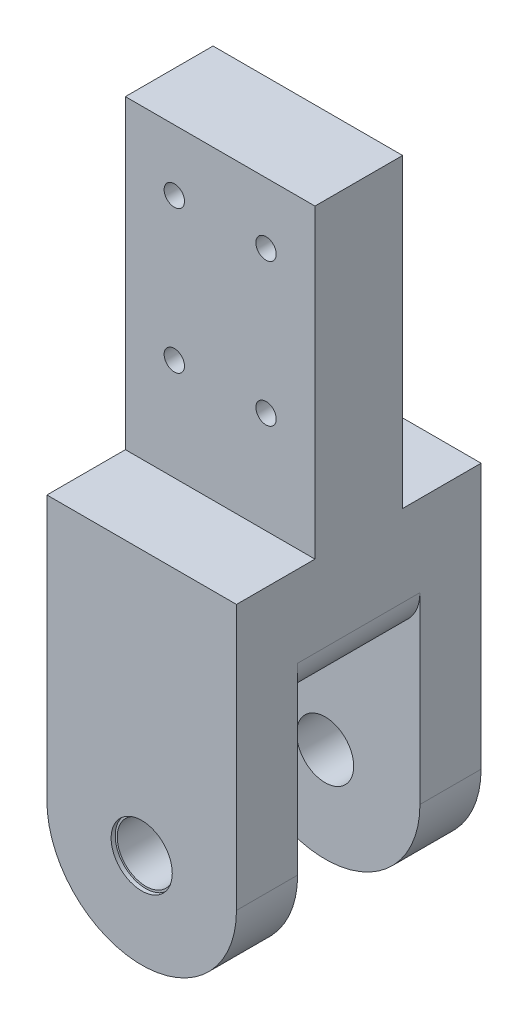
ISO-10303-21;
HEADER;
FILE_DESCRIPTION(('STEP AP214'),'2;1');
FILE_NAME('part.step','',(''),(''),'','','');
FILE_SCHEMA(('AUTOMOTIVE_DESIGN { 1 0 10303 214 1 1 1 1 }'));
ENDSEC;
DATA;
#1=APPLICATION_CONTEXT('core data for automotive mechanical design processes');
#2=APPLICATION_PROTOCOL_DEFINITION('international standard','automotive_design',2000,#1);
#3=PRODUCT_CONTEXT('',#1,'mechanical');
#4=PRODUCT('Part','Part','',(#3));
#5=PRODUCT_RELATED_PRODUCT_CATEGORY('part','',(#4));
#6=PRODUCT_DEFINITION_FORMATION('','',#4);
#7=PRODUCT_DEFINITION_CONTEXT('part definition',#1,'design');
#8=PRODUCT_DEFINITION('design','',#6,#7);
#9=PRODUCT_DEFINITION_SHAPE('','',#8);
#10=(LENGTH_UNIT() NAMED_UNIT(*) SI_UNIT(.MILLI.,.METRE.));
#11=(NAMED_UNIT(*) PLANE_ANGLE_UNIT() SI_UNIT($,.RADIAN.));
#12=(NAMED_UNIT(*) SI_UNIT($,.STERADIAN.) SOLID_ANGLE_UNIT());
#13=UNCERTAINTY_MEASURE_WITH_UNIT(LENGTH_MEASURE(1.E-05),#10,'distance_accuracy_value','');
#14=(GEOMETRIC_REPRESENTATION_CONTEXT(3) GLOBAL_UNCERTAINTY_ASSIGNED_CONTEXT((#13)) GLOBAL_UNIT_ASSIGNED_CONTEXT((#10,
#11,#12)) REPRESENTATION_CONTEXT('',''));
#15=CARTESIAN_POINT('',(0.,0.,0.));
#16=DIRECTION('',(0.,0.,1.));
#17=DIRECTION('',(1.,0.,0.));
#18=AXIS2_PLACEMENT_3D('',#15,#16,#17);
#19=CARTESIAN_POINT('',(23.25,140.,30.));
#20=DIRECTION('',(-1.,0.,0.));
#21=DIRECTION('',(0.,0.,1.));
#22=AXIS2_PLACEMENT_3D('',#19,#20,#21);
#23=PLANE('',#22);
#24=DIRECTION('',(0.,-1.,0.));
#25=VECTOR('',#24,1.);
#26=CARTESIAN_POINT('',(23.25,35.,15.));
#27=LINE('',#26,#25);
#28=CARTESIAN_POINT('',(23.25,45.,15.));
#29=VERTEX_POINT('',#28);
#30=CARTESIAN_POINT('',(23.25,0.,15.));
#31=VERTEX_POINT('',#30);
#32=EDGE_CURVE('E193',#29,#31,#27,.T.);
#33=ORIENTED_EDGE('',*,*,#32,.F.);
#34=DIRECTION('',(0.,0.,1.));
#35=VECTOR('',#34,1.);
#36=CARTESIAN_POINT('',(23.25,45.,30.));
#37=LINE('',#36,#35);
#38=CARTESIAN_POINT('',(23.25,45.,-15.));
#39=VERTEX_POINT('',#38);
#40=EDGE_CURVE('E215',#29,#39,#37,.F.);
#41=ORIENTED_EDGE('',*,*,#40,.T.);
#42=DIRECTION('',(0.,1.,0.));
#43=VECTOR('',#42,1.);
#44=CARTESIAN_POINT('',(23.25,35.,-15.));
#45=LINE('',#44,#43);
#46=CARTESIAN_POINT('',(23.25,0.,-15.));
#47=VERTEX_POINT('',#46);
#48=EDGE_CURVE('E274',#47,#39,#45,.T.);
#49=ORIENTED_EDGE('',*,*,#48,.F.);
#50=DIRECTION('',(0.,0.,-1.));
#51=VECTOR('',#50,1.);
#52=CARTESIAN_POINT('',(23.25,0.,30.));
#53=LINE('',#52,#51);
#54=CARTESIAN_POINT('',(23.25,0.,-30.));
#55=VERTEX_POINT('',#54);
#56=EDGE_CURVE('E171',#47,#55,#53,.T.);
#57=ORIENTED_EDGE('',*,*,#56,.T.);
#58=DIRECTION('',(0.,1.,0.));
#59=VECTOR('',#58,1.);
#60=CARTESIAN_POINT('',(23.25,140.,-30.));
#61=LINE('',#60,#59);
#62=CARTESIAN_POINT('',(23.25,65.,-30.));
#63=VERTEX_POINT('',#62);
#64=EDGE_CURVE('E256',#55,#63,#61,.T.);
#65=ORIENTED_EDGE('',*,*,#64,.T.);
#66=DIRECTION('',(0.,0.,-1.));
#67=VECTOR('',#66,1.);
#68=CARTESIAN_POINT('',(23.25,65.,-30.));
#69=LINE('',#68,#67);
#70=CARTESIAN_POINT('',(23.25,65.,-10.75));
#71=VERTEX_POINT('',#70);
#72=EDGE_CURVE('E275',#71,#63,#69,.T.);
#73=ORIENTED_EDGE('',*,*,#72,.F.);
#74=DIRECTION('',(0.,-1.,0.));
#75=VECTOR('',#74,1.);
#76=CARTESIAN_POINT('',(23.25,140.,-10.75));
#77=LINE('',#76,#75);
#78=CARTESIAN_POINT('',(23.25,140.,-10.75));
#79=VERTEX_POINT('',#78);
#80=EDGE_CURVE('E154',#79,#71,#77,.T.);
#81=ORIENTED_EDGE('',*,*,#80,.F.);
#82=DIRECTION('',(0.,0.,-1.));
#83=VECTOR('',#82,1.);
#84=CARTESIAN_POINT('',(23.25,140.,30.));
#85=LINE('',#84,#83);
#86=CARTESIAN_POINT('',(23.25,140.,10.75));
#87=VERTEX_POINT('',#86);
#88=EDGE_CURVE('E161',#87,#79,#85,.T.);
#89=ORIENTED_EDGE('',*,*,#88,.F.);
#90=DIRECTION('',(0.,-1.,0.));
#91=VECTOR('',#90,1.);
#92=CARTESIAN_POINT('',(23.25,140.,10.75));
#93=LINE('',#92,#91);
#94=CARTESIAN_POINT('',(23.25,65.,10.75));
#95=VERTEX_POINT('',#94);
#96=EDGE_CURVE('E316',#87,#95,#93,.T.);
#97=ORIENTED_EDGE('',*,*,#96,.T.);
#98=DIRECTION('',(0.,0.,-1.));
#99=VECTOR('',#98,1.);
#100=CARTESIAN_POINT('',(23.25,65.,30.));
#101=LINE('',#100,#99);
#102=CARTESIAN_POINT('',(23.25,65.,30.));
#103=VERTEX_POINT('',#102);
#104=EDGE_CURVE('E292',#103,#95,#101,.T.);
#105=ORIENTED_EDGE('',*,*,#104,.F.);
#106=DIRECTION('',(0.,1.,0.));
#107=VECTOR('',#106,1.);
#108=CARTESIAN_POINT('',(23.25,140.,30.));
#109=LINE('',#108,#107);
#110=CARTESIAN_POINT('',(23.25,0.,30.));
#111=VERTEX_POINT('',#110);
#112=EDGE_CURVE('E248',#111,#103,#109,.T.);
#113=ORIENTED_EDGE('',*,*,#112,.F.);
#114=EDGE_CURVE('E178',#111,#31,#53,.T.);
#115=ORIENTED_EDGE('',*,*,#114,.T.);
#116=EDGE_LOOP('',(#33,#41,#49,#57,#65,#73,#81,#89,#97,#105,#113,#115));
#117=FACE_BOUND('',#116,.T.);
#118=ADVANCED_FACE('F41',(#117),#23,.F.);
#119=CARTESIAN_POINT('',(-23.25,140.,30.));
#120=DIRECTION('',(0.,-1.,0.));
#121=DIRECTION('',(0.,0.,-1.));
#122=AXIS2_PLACEMENT_3D('',#119,#120,#121);
#123=PLANE('',#122);
#124=DIRECTION('',(1.,0.,0.));
#125=VECTOR('',#124,1.);
#126=CARTESIAN_POINT('',(-23.25,140.,-10.75));
#127=LINE('',#126,#125);
#128=CARTESIAN_POINT('',(-23.25,140.,-10.75));
#129=VERTEX_POINT('',#128);
#130=EDGE_CURVE('E146',#129,#79,#127,.T.);
#131=ORIENTED_EDGE('',*,*,#130,.F.);
#132=DIRECTION('',(0.,0.,-1.));
#133=VECTOR('',#132,1.);
#134=CARTESIAN_POINT('',(-23.25,140.,30.));
#135=LINE('',#134,#133);
#136=CARTESIAN_POINT('',(-23.25,140.,10.75));
#137=VERTEX_POINT('',#136);
#138=EDGE_CURVE('E163',#137,#129,#135,.T.);
#139=ORIENTED_EDGE('',*,*,#138,.F.);
#140=DIRECTION('',(-1.,0.,0.));
#141=VECTOR('',#140,1.);
#142=CARTESIAN_POINT('',(23.25,140.,10.75));
#143=LINE('',#142,#141);
#144=EDGE_CURVE('E312',#87,#137,#143,.T.);
#145=ORIENTED_EDGE('',*,*,#144,.F.);
#146=ORIENTED_EDGE('',*,*,#88,.T.);
#147=EDGE_LOOP('',(#131,#139,#145,#146));
#148=FACE_BOUND('',#147,.T.);
#149=ADVANCED_FACE('F157',(#148),#123,.F.);
#150=CARTESIAN_POINT('',(-23.25,0.,30.));
#151=DIRECTION('',(1.,0.,0.));
#152=DIRECTION('',(0.,0.,-1.));
#153=AXIS2_PLACEMENT_3D('',#150,#151,#152);
#154=PLANE('',#153);
#155=DIRECTION('',(0.,0.,1.));
#156=VECTOR('',#155,1.);
#157=CARTESIAN_POINT('',(-23.25,45.,30.));
#158=LINE('',#157,#156);
#159=CARTESIAN_POINT('',(-23.25,45.,-15.));
#160=VERTEX_POINT('',#159);
#161=CARTESIAN_POINT('',(-23.25,45.,15.));
#162=VERTEX_POINT('',#161);
#163=EDGE_CURVE('E217',#160,#162,#158,.T.);
#164=ORIENTED_EDGE('',*,*,#163,.T.);
#165=DIRECTION('',(0.,-1.,0.));
#166=VECTOR('',#165,1.);
#167=CARTESIAN_POINT('',(-23.25,35.,15.));
#168=LINE('',#167,#166);
#169=CARTESIAN_POINT('',(-23.25,0.,15.));
#170=VERTEX_POINT('',#169);
#171=EDGE_CURVE('E57',#162,#170,#168,.T.);
#172=ORIENTED_EDGE('',*,*,#171,.T.);
#173=DIRECTION('',(0.,0.,-1.));
#174=VECTOR('',#173,1.);
#175=CARTESIAN_POINT('',(-23.25,0.,30.));
#176=LINE('',#175,#174);
#177=CARTESIAN_POINT('',(-23.25,0.,30.));
#178=VERTEX_POINT('',#177);
#179=EDGE_CURVE('E169',#178,#170,#176,.T.);
#180=ORIENTED_EDGE('',*,*,#179,.F.);
#181=DIRECTION('',(0.,-1.,0.));
#182=VECTOR('',#181,1.);
#183=CARTESIAN_POINT('',(-23.25,0.,30.));
#184=LINE('',#183,#182);
#185=CARTESIAN_POINT('',(-23.25,65.,30.));
#186=VERTEX_POINT('',#185);
#187=EDGE_CURVE('E254',#186,#178,#184,.T.);
#188=ORIENTED_EDGE('',*,*,#187,.F.);
#189=DIRECTION('',(0.,0.,-1.));
#190=VECTOR('',#189,1.);
#191=CARTESIAN_POINT('',(-23.25,65.,30.));
#192=LINE('',#191,#190);
#193=CARTESIAN_POINT('',(-23.25,65.,10.75));
#194=VERTEX_POINT('',#193);
#195=EDGE_CURVE('E298',#186,#194,#192,.T.);
#196=ORIENTED_EDGE('',*,*,#195,.T.);
#197=DIRECTION('',(0.,-1.,0.));
#198=VECTOR('',#197,1.);
#199=CARTESIAN_POINT('',(-23.25,140.,10.75));
#200=LINE('',#199,#198);
#201=EDGE_CURVE('E166',#137,#194,#200,.T.);
#202=ORIENTED_EDGE('',*,*,#201,.F.);
#203=ORIENTED_EDGE('',*,*,#138,.T.);
#204=DIRECTION('',(0.,-1.,0.));
#205=VECTOR('',#204,1.);
#206=CARTESIAN_POINT('',(-23.25,140.,-10.75));
#207=LINE('',#206,#205);
#208=CARTESIAN_POINT('',(-23.25,65.,-10.75));
#209=VERTEX_POINT('',#208);
#210=EDGE_CURVE('E141',#129,#209,#207,.T.);
#211=ORIENTED_EDGE('',*,*,#210,.T.);
#212=DIRECTION('',(0.,0.,-1.));
#213=VECTOR('',#212,1.);
#214=CARTESIAN_POINT('',(-23.25,65.,-30.));
#215=LINE('',#214,#213);
#216=CARTESIAN_POINT('',(-23.25,65.,-30.));
#217=VERTEX_POINT('',#216);
#218=EDGE_CURVE('E262',#209,#217,#215,.T.);
#219=ORIENTED_EDGE('',*,*,#218,.T.);
#220=DIRECTION('',(0.,-1.,0.));
#221=VECTOR('',#220,1.);
#222=CARTESIAN_POINT('',(-23.25,0.,-30.));
#223=LINE('',#222,#221);
#224=CARTESIAN_POINT('',(-23.25,0.,-30.));
#225=VERTEX_POINT('',#224);
#226=EDGE_CURVE('E249',#217,#225,#223,.T.);
#227=ORIENTED_EDGE('',*,*,#226,.T.);
#228=CARTESIAN_POINT('',(-23.25,0.,-15.));
#229=VERTEX_POINT('',#228);
#230=EDGE_CURVE('E172',#229,#225,#176,.T.);
#231=ORIENTED_EDGE('',*,*,#230,.F.);
#232=DIRECTION('',(0.,1.,0.));
#233=VECTOR('',#232,1.);
#234=CARTESIAN_POINT('',(-23.25,35.,-15.));
#235=LINE('',#234,#233);
#236=EDGE_CURVE('E63',#229,#160,#235,.T.);
#237=ORIENTED_EDGE('',*,*,#236,.T.);
#238=EDGE_LOOP('',(#164,#172,#180,#188,#196,#202,#203,#211,#219,#227,#231,#237));
#239=FACE_BOUND('',#238,.T.);
#240=ADVANCED_FACE('F168',(#239),#154,.F.);
#241=CARTESIAN_POINT('',(0.,0.,30.));
#242=DIRECTION('',(0.,0.,-1.));
#243=DIRECTION('',(-1.,0.,0.));
#244=AXIS2_PLACEMENT_3D('',#241,#242,#243);
#245=CYLINDRICAL_SURFACE('',#244,7.);
#246=CARTESIAN_POINT('',(0.,0.,-15.));
#247=DIRECTION('',(0.,0.,-1.));
#248=DIRECTION('',(0.,1.,0.));
#249=AXIS2_PLACEMENT_3D('',#246,#247,#248);
#250=CIRCLE('',#249,7.);
#251=CARTESIAN_POINT('',(0.,7.,-15.));
#252=VERTEX_POINT('',#251);
#253=EDGE_CURVE('E185',#252,#252,#250,.T.);
#254=ORIENTED_EDGE('',*,*,#253,.F.);
#255=EDGE_LOOP('',(#254));
#256=FACE_BOUND('',#255,.T.);
#257=CARTESIAN_POINT('',(0.,0.,-29.));
#258=DIRECTION('',(0.,0.,-1.));
#259=DIRECTION('',(-1.,0.,0.));
#260=AXIS2_PLACEMENT_3D('',#257,#258,#259);
#261=CIRCLE('',#260,7.);
#262=CARTESIAN_POINT('',(-7.,0.,-29.));
#263=VERTEX_POINT('',#262);
#264=EDGE_CURVE('E197',#263,#263,#261,.T.);
#265=ORIENTED_EDGE('',*,*,#264,.T.);
#266=EDGE_LOOP('',(#265));
#267=FACE_BOUND('',#266,.T.);
#268=ADVANCED_FACE('F377',(#256,#267),#245,.F.);
#269=CARTESIAN_POINT('',(0.,0.,15.));
#270=DIRECTION('',(0.,0.,1.));
#271=DIRECTION('',(0.,-1.,0.));
#272=AXIS2_PLACEMENT_3D('',#269,#270,#271);
#273=CIRCLE('',#272,7.);
#274=CARTESIAN_POINT('',(0.,-7.,15.));
#275=VERTEX_POINT('',#274);
#276=EDGE_CURVE('E190',#275,#275,#273,.T.);
#277=ORIENTED_EDGE('',*,*,#276,.F.);
#278=EDGE_LOOP('',(#277));
#279=FACE_BOUND('',#278,.T.);
#280=CARTESIAN_POINT('',(0.,0.,29.));
#281=DIRECTION('',(0.,0.,1.));
#282=DIRECTION('',(1.,0.,0.));
#283=AXIS2_PLACEMENT_3D('',#280,#281,#282);
#284=CIRCLE('',#283,7.);
#285=CARTESIAN_POINT('',(7.,0.,29.));
#286=VERTEX_POINT('',#285);
#287=EDGE_CURVE('E194',#286,#286,#284,.T.);
#288=ORIENTED_EDGE('',*,*,#287,.T.);
#289=EDGE_LOOP('',(#288));
#290=FACE_BOUND('',#289,.T.);
#291=ADVANCED_FACE('F373',(#279,#290),#245,.F.);
#292=CARTESIAN_POINT('',(0.,0.,30.));
#293=DIRECTION('',(0.,0.,-1.));
#294=DIRECTION('',(-1.,0.,0.));
#295=AXIS2_PLACEMENT_3D('',#292,#293,#294);
#296=CYLINDRICAL_SURFACE('',#295,23.25);
#297=CARTESIAN_POINT('',(0.,0.,15.));
#298=DIRECTION('',(0.,0.,1.));
#299=DIRECTION('',(0.,-1.,0.));
#300=AXIS2_PLACEMENT_3D('',#297,#298,#299);
#301=CIRCLE('',#300,23.25);
#302=EDGE_CURVE('E188',#170,#31,#301,.T.);
#303=ORIENTED_EDGE('',*,*,#302,.T.);
#304=ORIENTED_EDGE('',*,*,#114,.F.);
#305=CARTESIAN_POINT('',(0.,0.,30.));
#306=DIRECTION('',(0.,0.,1.));
#307=DIRECTION('',(1.,0.,0.));
#308=AXIS2_PLACEMENT_3D('',#305,#306,#307);
#309=CIRCLE('',#308,23.25);
#310=EDGE_CURVE('E246',#178,#111,#309,.T.);
#311=ORIENTED_EDGE('',*,*,#310,.F.);
#312=ORIENTED_EDGE('',*,*,#179,.T.);
#313=EDGE_LOOP('',(#303,#304,#311,#312));
#314=FACE_BOUND('',#313,.T.);
#315=ADVANCED_FACE('F338',(#314),#296,.T.);
#316=CARTESIAN_POINT('',(0.,0.,30.));
#317=DIRECTION('',(0.,0.,1.));
#318=DIRECTION('',(1.,0.,0.));
#319=AXIS2_PLACEMENT_3D('',#316,#317,#318);
#320=PLANE('',#319);
#321=DIRECTION('',(1.,0.,0.));
#322=VECTOR('',#321,1.);
#323=CARTESIAN_POINT('',(-23.25,65.,30.));
#324=LINE('',#323,#322);
#325=EDGE_CURVE('E290',#186,#103,#324,.T.);
#326=ORIENTED_EDGE('',*,*,#325,.F.);
#327=ORIENTED_EDGE('',*,*,#187,.T.);
#328=ORIENTED_EDGE('',*,*,#310,.T.);
#329=ORIENTED_EDGE('',*,*,#112,.T.);
#330=EDGE_LOOP('',(#326,#327,#328,#329));
#331=FACE_BOUND('',#330,.T.);
#332=CARTESIAN_POINT('',(0.,0.,30.));
#333=DIRECTION('',(0.,0.,1.));
#334=DIRECTION('',(1.,0.,0.));
#335=AXIS2_PLACEMENT_3D('',#332,#333,#334);
#336=CIRCLE('',#335,7.5);
#337=CARTESIAN_POINT('',(7.5,0.,30.));
#338=VERTEX_POINT('',#337);
#339=EDGE_CURVE('E199',#338,#338,#336,.T.);
#340=ORIENTED_EDGE('',*,*,#339,.F.);
#341=EDGE_LOOP('',(#340));
#342=FACE_BOUND('',#341,.T.);
#343=ADVANCED_FACE('F332',(#331,#342),#320,.T.);
#344=CARTESIAN_POINT('',(0.,0.,-30.));
#345=DIRECTION('',(0.,0.,1.));
#346=DIRECTION('',(1.,0.,0.));
#347=AXIS2_PLACEMENT_3D('',#344,#345,#346);
#348=PLANE('',#347);
#349=CARTESIAN_POINT('',(0.,0.,-30.));
#350=DIRECTION('',(0.,0.,-1.));
#351=DIRECTION('',(-1.,0.,0.));
#352=AXIS2_PLACEMENT_3D('',#349,#350,#351);
#353=CIRCLE('',#352,7.5);
#354=CARTESIAN_POINT('',(-7.5,0.,-30.));
#355=VERTEX_POINT('',#354);
#356=EDGE_CURVE('E284',#355,#355,#353,.T.);
#357=ORIENTED_EDGE('',*,*,#356,.F.);
#358=EDGE_LOOP('',(#357));
#359=FACE_BOUND('',#358,.T.);
#360=ORIENTED_EDGE('',*,*,#226,.F.);
#361=DIRECTION('',(1.,0.,0.));
#362=VECTOR('',#361,1.);
#363=CARTESIAN_POINT('',(-23.25,65.,-30.));
#364=LINE('',#363,#362);
#365=EDGE_CURVE('E269',#217,#63,#364,.T.);
#366=ORIENTED_EDGE('',*,*,#365,.T.);
#367=ORIENTED_EDGE('',*,*,#64,.F.);
#368=CARTESIAN_POINT('',(0.,0.,-30.));
#369=DIRECTION('',(0.,0.,1.));
#370=DIRECTION('',(1.,0.,0.));
#371=AXIS2_PLACEMENT_3D('',#368,#369,#370);
#372=CIRCLE('',#371,23.25);
#373=EDGE_CURVE('E244',#225,#55,#372,.T.);
#374=ORIENTED_EDGE('',*,*,#373,.F.);
#375=EDGE_LOOP('',(#360,#366,#367,#374));
#376=FACE_BOUND('',#375,.T.);
#377=ADVANCED_FACE('F267',(#359,#376),#348,.F.);
#378=ORIENTED_EDGE('',*,*,#56,.F.);
#379=CARTESIAN_POINT('',(0.,0.,-15.));
#380=DIRECTION('',(0.,0.,-1.));
#381=DIRECTION('',(0.,1.,0.));
#382=AXIS2_PLACEMENT_3D('',#379,#380,#381);
#383=CIRCLE('',#382,23.25);
#384=EDGE_CURVE('E184',#47,#229,#383,.T.);
#385=ORIENTED_EDGE('',*,*,#384,.T.);
#386=ORIENTED_EDGE('',*,*,#230,.T.);
#387=ORIENTED_EDGE('',*,*,#373,.T.);
#388=EDGE_LOOP('',(#378,#385,#386,#387));
#389=FACE_BOUND('',#388,.T.);
#390=ADVANCED_FACE('F270',(#389),#296,.T.);
#391=CARTESIAN_POINT('',(-23.25,35.,15.));
#392=DIRECTION('',(0.,0.,1.));
#393=DIRECTION('',(0.,-1.,0.));
#394=AXIS2_PLACEMENT_3D('',#391,#392,#393);
#395=PLANE('',#394);
#396=ORIENTED_EDGE('',*,*,#276,.T.);
#397=EDGE_LOOP('',(#396));
#398=FACE_BOUND('',#397,.T.);
#399=ORIENTED_EDGE('',*,*,#302,.F.);
#400=ORIENTED_EDGE('',*,*,#171,.F.);
#401=CARTESIAN_POINT('',(-13.25,45.,15.));
#402=DIRECTION('',(0.,0.,1.));
#403=DIRECTION('',(0.,-1.,0.));
#404=AXIS2_PLACEMENT_3D('',#401,#402,#403);
#405=CIRCLE('',#404,10.);
#406=CARTESIAN_POINT('',(-13.25,35.,15.));
#407=VERTEX_POINT('',#406);
#408=EDGE_CURVE('E47',#162,#407,#405,.T.);
#409=ORIENTED_EDGE('',*,*,#408,.T.);
#410=DIRECTION('',(1.,0.,0.));
#411=VECTOR('',#410,1.);
#412=CARTESIAN_POINT('',(-23.25,35.,15.));
#413=LINE('',#412,#411);
#414=CARTESIAN_POINT('',(13.25,35.,15.));
#415=VERTEX_POINT('',#414);
#416=EDGE_CURVE('E187',#407,#415,#413,.T.);
#417=ORIENTED_EDGE('',*,*,#416,.T.);
#418=CARTESIAN_POINT('',(13.25,45.,15.));
#419=DIRECTION('',(0.,0.,1.));
#420=DIRECTION('',(0.,-1.,0.));
#421=AXIS2_PLACEMENT_3D('',#418,#419,#420);
#422=CIRCLE('',#421,10.);
#423=EDGE_CURVE('E218',#415,#29,#422,.T.);
#424=ORIENTED_EDGE('',*,*,#423,.T.);
#425=ORIENTED_EDGE('',*,*,#32,.T.);
#426=EDGE_LOOP('',(#399,#400,#409,#417,#424,#425));
#427=FACE_BOUND('',#426,.T.);
#428=ADVANCED_FACE('F222',(#398,#427),#395,.F.);
#429=CARTESIAN_POINT('',(-23.25,35.,-15.));
#430=DIRECTION('',(0.,0.,-1.));
#431=DIRECTION('',(0.,1.,0.));
#432=AXIS2_PLACEMENT_3D('',#429,#430,#431);
#433=PLANE('',#432);
#434=ORIENTED_EDGE('',*,*,#253,.T.);
#435=EDGE_LOOP('',(#434));
#436=FACE_BOUND('',#435,.T.);
#437=ORIENTED_EDGE('',*,*,#48,.T.);
#438=CARTESIAN_POINT('',(13.25,45.,-15.));
#439=DIRECTION('',(0.,0.,-1.));
#440=DIRECTION('',(0.,1.,0.));
#441=AXIS2_PLACEMENT_3D('',#438,#439,#440);
#442=CIRCLE('',#441,10.);
#443=CARTESIAN_POINT('',(13.25,35.,-15.));
#444=VERTEX_POINT('',#443);
#445=EDGE_CURVE('E221',#39,#444,#442,.T.);
#446=ORIENTED_EDGE('',*,*,#445,.T.);
#447=DIRECTION('',(1.,0.,0.));
#448=VECTOR('',#447,1.);
#449=CARTESIAN_POINT('',(-23.25,35.,-15.));
#450=LINE('',#449,#448);
#451=CARTESIAN_POINT('',(-13.25,35.,-15.));
#452=VERTEX_POINT('',#451);
#453=EDGE_CURVE('E231',#452,#444,#450,.T.);
#454=ORIENTED_EDGE('',*,*,#453,.F.);
#455=CARTESIAN_POINT('',(-13.25,45.,-15.));
#456=DIRECTION('',(0.,0.,-1.));
#457=DIRECTION('',(0.,1.,0.));
#458=AXIS2_PLACEMENT_3D('',#455,#456,#457);
#459=CIRCLE('',#458,10.);
#460=EDGE_CURVE('E11',#452,#160,#459,.T.);
#461=ORIENTED_EDGE('',*,*,#460,.T.);
#462=ORIENTED_EDGE('',*,*,#236,.F.);
#463=ORIENTED_EDGE('',*,*,#384,.F.);
#464=EDGE_LOOP('',(#437,#446,#454,#461,#462,#463));
#465=FACE_BOUND('',#464,.T.);
#466=ADVANCED_FACE('F240',(#436,#465),#433,.F.);
#467=CARTESIAN_POINT('',(-23.25,35.,15.));
#468=DIRECTION('',(0.,1.,0.));
#469=DIRECTION('',(0.,0.,1.));
#470=AXIS2_PLACEMENT_3D('',#467,#468,#469);
#471=PLANE('',#470);
#472=ORIENTED_EDGE('',*,*,#453,.T.);
#473=DIRECTION('',(0.,0.,1.));
#474=VECTOR('',#473,1.);
#475=CARTESIAN_POINT('',(13.25,35.,15.));
#476=LINE('',#475,#474);
#477=EDGE_CURVE('E208',#444,#415,#476,.T.);
#478=ORIENTED_EDGE('',*,*,#477,.T.);
#479=ORIENTED_EDGE('',*,*,#416,.F.);
#480=DIRECTION('',(0.,0.,1.));
#481=VECTOR('',#480,1.);
#482=CARTESIAN_POINT('',(-13.25,35.,15.));
#483=LINE('',#482,#481);
#484=EDGE_CURVE('E181',#407,#452,#483,.F.);
#485=ORIENTED_EDGE('',*,*,#484,.T.);
#486=EDGE_LOOP('',(#472,#478,#479,#485));
#487=FACE_BOUND('',#486,.T.);
#488=ADVANCED_FACE('F229',(#487),#471,.F.);
#489=CARTESIAN_POINT('',(0.,0.,29.));
#490=DIRECTION('',(0.,0.,1.));
#491=DIRECTION('',(1.,0.,0.));
#492=AXIS2_PLACEMENT_3D('',#489,#490,#491);
#493=CYLINDRICAL_SURFACE('',#492,7.5);
#494=CARTESIAN_POINT('',(0.,0.,29.));
#495=DIRECTION('',(0.,0.,1.));
#496=DIRECTION('',(1.,0.,0.));
#497=AXIS2_PLACEMENT_3D('',#494,#495,#496);
#498=CIRCLE('',#497,7.5);
#499=CARTESIAN_POINT('',(7.5,0.,29.));
#500=VERTEX_POINT('',#499);
#501=EDGE_CURVE('E192',#500,#500,#498,.T.);
#502=ORIENTED_EDGE('',*,*,#501,.F.);
#503=EDGE_LOOP('',(#502));
#504=FACE_BOUND('',#503,.T.);
#505=ORIENTED_EDGE('',*,*,#339,.T.);
#506=EDGE_LOOP('',(#505));
#507=FACE_BOUND('',#506,.T.);
#508=ADVANCED_FACE('F414',(#504,#507),#493,.F.);
#509=CARTESIAN_POINT('',(0.,0.,29.));
#510=DIRECTION('',(0.,0.,1.));
#511=DIRECTION('',(1.,0.,0.));
#512=AXIS2_PLACEMENT_3D('',#509,#510,#511);
#513=PLANE('',#512);
#514=ORIENTED_EDGE('',*,*,#287,.F.);
#515=EDGE_LOOP('',(#514));
#516=FACE_BOUND('',#515,.T.);
#517=ORIENTED_EDGE('',*,*,#501,.T.);
#518=EDGE_LOOP('',(#517));
#519=FACE_BOUND('',#518,.T.);
#520=ADVANCED_FACE('F429',(#516,#519),#513,.T.);
#521=CARTESIAN_POINT('',(0.,0.,-29.));
#522=DIRECTION('',(0.,0.,-1.));
#523=DIRECTION('',(-1.,0.,0.));
#524=AXIS2_PLACEMENT_3D('',#521,#522,#523);
#525=CYLINDRICAL_SURFACE('',#524,7.5);
#526=CARTESIAN_POINT('',(0.,0.,-29.));
#527=DIRECTION('',(0.,0.,-1.));
#528=DIRECTION('',(-1.,0.,0.));
#529=AXIS2_PLACEMENT_3D('',#526,#527,#528);
#530=CIRCLE('',#529,7.5);
#531=CARTESIAN_POINT('',(-7.5,0.,-29.));
#532=VERTEX_POINT('',#531);
#533=EDGE_CURVE('E196',#532,#532,#530,.T.);
#534=ORIENTED_EDGE('',*,*,#533,.F.);
#535=EDGE_LOOP('',(#534));
#536=FACE_BOUND('',#535,.T.);
#537=ORIENTED_EDGE('',*,*,#356,.T.);
#538=EDGE_LOOP('',(#537));
#539=FACE_BOUND('',#538,.T.);
#540=ADVANCED_FACE('F437',(#536,#539),#525,.F.);
#541=CARTESIAN_POINT('',(0.,0.,-29.));
#542=DIRECTION('',(0.,0.,-1.));
#543=DIRECTION('',(-1.,0.,0.));
#544=AXIS2_PLACEMENT_3D('',#541,#542,#543);
#545=PLANE('',#544);
#546=ORIENTED_EDGE('',*,*,#264,.F.);
#547=EDGE_LOOP('',(#546));
#548=FACE_BOUND('',#547,.T.);
#549=ORIENTED_EDGE('',*,*,#533,.T.);
#550=EDGE_LOOP('',(#549));
#551=FACE_BOUND('',#550,.T.);
#552=ADVANCED_FACE('F453',(#548,#551),#545,.T.);
#553=CARTESIAN_POINT('',(-23.25,65.,-30.));
#554=DIRECTION('',(0.,-1.,0.));
#555=DIRECTION('',(0.,0.,-1.));
#556=AXIS2_PLACEMENT_3D('',#553,#554,#555);
#557=PLANE('',#556);
#558=ORIENTED_EDGE('',*,*,#72,.T.);
#559=ORIENTED_EDGE('',*,*,#365,.F.);
#560=ORIENTED_EDGE('',*,*,#218,.F.);
#561=DIRECTION('',(1.,0.,0.));
#562=VECTOR('',#561,1.);
#563=CARTESIAN_POINT('',(-23.25,65.,-10.75));
#564=LINE('',#563,#562);
#565=EDGE_CURVE('E147',#209,#71,#564,.T.);
#566=ORIENTED_EDGE('',*,*,#565,.T.);
#567=EDGE_LOOP('',(#558,#559,#560,#566));
#568=FACE_BOUND('',#567,.T.);
#569=ADVANCED_FACE('F323',(#568),#557,.F.);
#570=CARTESIAN_POINT('',(-23.25,65.,30.));
#571=DIRECTION('',(0.,-1.,0.));
#572=DIRECTION('',(0.,0.,-1.));
#573=AXIS2_PLACEMENT_3D('',#570,#571,#572);
#574=PLANE('',#573);
#575=ORIENTED_EDGE('',*,*,#104,.T.);
#576=DIRECTION('',(-1.,0.,0.));
#577=VECTOR('',#576,1.);
#578=CARTESIAN_POINT('',(23.25,65.,10.75));
#579=LINE('',#578,#577);
#580=EDGE_CURVE('E314',#95,#194,#579,.T.);
#581=ORIENTED_EDGE('',*,*,#580,.T.);
#582=ORIENTED_EDGE('',*,*,#195,.F.);
#583=ORIENTED_EDGE('',*,*,#325,.T.);
#584=EDGE_LOOP('',(#575,#581,#582,#583));
#585=FACE_BOUND('',#584,.T.);
#586=ADVANCED_FACE('F326',(#585),#574,.F.);
#587=CARTESIAN_POINT('',(23.25,140.,10.75));
#588=DIRECTION('',(0.,0.,1.));
#589=DIRECTION('',(1.,0.,0.));
#590=AXIS2_PLACEMENT_3D('',#587,#588,#589);
#591=PLANE('',#590);
#592=CARTESIAN_POINT('',(11.25,90.,10.75));
#593=DIRECTION('',(0.,0.,1.));
#594=DIRECTION('',(1.,0.,0.));
#595=AXIS2_PLACEMENT_3D('',#592,#593,#594);
#596=CIRCLE('',#595,2.5);
#597=CARTESIAN_POINT('',(13.75,90.,10.75));
#598=VERTEX_POINT('',#597);
#599=EDGE_CURVE('E206',#598,#598,#596,.T.);
#600=ORIENTED_EDGE('',*,*,#599,.F.);
#601=EDGE_LOOP('',(#600));
#602=FACE_BOUND('',#601,.T.);
#603=CARTESIAN_POINT('',(-11.25,125.,10.75));
#604=DIRECTION('',(0.,0.,1.));
#605=DIRECTION('',(1.,0.,0.));
#606=AXIS2_PLACEMENT_3D('',#603,#604,#605);
#607=CIRCLE('',#606,2.5);
#608=CARTESIAN_POINT('',(-8.75,125.,10.75));
#609=VERTEX_POINT('',#608);
#610=EDGE_CURVE('E308',#609,#609,#607,.T.);
#611=ORIENTED_EDGE('',*,*,#610,.F.);
#612=EDGE_LOOP('',(#611));
#613=FACE_BOUND('',#612,.T.);
#614=CARTESIAN_POINT('',(11.25,125.,10.75));
#615=DIRECTION('',(0.,0.,1.));
#616=DIRECTION('',(1.,0.,0.));
#617=AXIS2_PLACEMENT_3D('',#614,#615,#616);
#618=CIRCLE('',#617,2.50000000000001);
#619=CARTESIAN_POINT('',(13.75,125.,10.75));
#620=VERTEX_POINT('',#619);
#621=EDGE_CURVE('E203',#620,#620,#618,.T.);
#622=ORIENTED_EDGE('',*,*,#621,.F.);
#623=EDGE_LOOP('',(#622));
#624=FACE_BOUND('',#623,.T.);
#625=CARTESIAN_POINT('',(-11.25,90.,10.75));
#626=DIRECTION('',(0.,0.,1.));
#627=DIRECTION('',(1.,0.,0.));
#628=AXIS2_PLACEMENT_3D('',#625,#626,#627);
#629=CIRCLE('',#628,2.50000000000001);
#630=CARTESIAN_POINT('',(-8.74999999999999,90.,10.75));
#631=VERTEX_POINT('',#630);
#632=EDGE_CURVE('E153',#631,#631,#629,.T.);
#633=ORIENTED_EDGE('',*,*,#632,.F.);
#634=EDGE_LOOP('',(#633));
#635=FACE_BOUND('',#634,.T.);
#636=ORIENTED_EDGE('',*,*,#580,.F.);
#637=ORIENTED_EDGE('',*,*,#96,.F.);
#638=ORIENTED_EDGE('',*,*,#144,.T.);
#639=ORIENTED_EDGE('',*,*,#201,.T.);
#640=EDGE_LOOP('',(#636,#637,#638,#639));
#641=FACE_BOUND('',#640,.T.);
#642=ADVANCED_FACE('F328',(#602,#613,#624,#635,#641),#591,.T.);
#643=CARTESIAN_POINT('',(-23.25,140.,-10.75));
#644=DIRECTION('',(0.,0.,-1.));
#645=DIRECTION('',(-1.,0.,0.));
#646=AXIS2_PLACEMENT_3D('',#643,#644,#645);
#647=PLANE('',#646);
#648=CARTESIAN_POINT('',(11.25,90.,-10.75));
#649=DIRECTION('',(0.,0.,-1.));
#650=DIRECTION('',(-1.,0.,0.));
#651=AXIS2_PLACEMENT_3D('',#648,#649,#650);
#652=CIRCLE('',#651,2.5);
#653=CARTESIAN_POINT('',(8.75000000000001,90.,-10.75));
#654=VERTEX_POINT('',#653);
#655=EDGE_CURVE('E295',#654,#654,#652,.T.);
#656=ORIENTED_EDGE('',*,*,#655,.F.);
#657=EDGE_LOOP('',(#656));
#658=FACE_BOUND('',#657,.T.);
#659=CARTESIAN_POINT('',(-11.25,125.,-10.75));
#660=DIRECTION('',(0.,0.,-1.));
#661=DIRECTION('',(-1.,0.,0.));
#662=AXIS2_PLACEMENT_3D('',#659,#660,#661);
#663=CIRCLE('',#662,2.5);
#664=CARTESIAN_POINT('',(-13.75,125.,-10.75));
#665=VERTEX_POINT('',#664);
#666=EDGE_CURVE('E301',#665,#665,#663,.T.);
#667=ORIENTED_EDGE('',*,*,#666,.F.);
#668=EDGE_LOOP('',(#667));
#669=FACE_BOUND('',#668,.T.);
#670=CARTESIAN_POINT('',(11.25,125.,-10.75));
#671=DIRECTION('',(0.,0.,-1.));
#672=DIRECTION('',(-1.,0.,0.));
#673=AXIS2_PLACEMENT_3D('',#670,#671,#672);
#674=CIRCLE('',#673,2.50000000000001);
#675=CARTESIAN_POINT('',(8.74999999999999,125.,-10.75));
#676=VERTEX_POINT('',#675);
#677=EDGE_CURVE('E210',#676,#676,#674,.T.);
#678=ORIENTED_EDGE('',*,*,#677,.F.);
#679=EDGE_LOOP('',(#678));
#680=FACE_BOUND('',#679,.T.);
#681=CARTESIAN_POINT('',(-11.25,90.,-10.75));
#682=DIRECTION('',(0.,0.,-1.));
#683=DIRECTION('',(-1.,0.,0.));
#684=AXIS2_PLACEMENT_3D('',#681,#682,#683);
#685=CIRCLE('',#684,2.50000000000001);
#686=CARTESIAN_POINT('',(-13.75,90.,-10.75));
#687=VERTEX_POINT('',#686);
#688=EDGE_CURVE('E202',#687,#687,#685,.T.);
#689=ORIENTED_EDGE('',*,*,#688,.F.);
#690=EDGE_LOOP('',(#689));
#691=FACE_BOUND('',#690,.T.);
#692=ORIENTED_EDGE('',*,*,#565,.F.);
#693=ORIENTED_EDGE('',*,*,#210,.F.);
#694=ORIENTED_EDGE('',*,*,#130,.T.);
#695=ORIENTED_EDGE('',*,*,#80,.T.);
#696=EDGE_LOOP('',(#692,#693,#694,#695));
#697=FACE_BOUND('',#696,.T.);
#698=ADVANCED_FACE('F143',(#658,#669,#680,#691,#697),#647,.T.);
#699=CARTESIAN_POINT('',(11.25,125.,30.));
#700=DIRECTION('',(0.,0.,-1.));
#701=DIRECTION('',(-1.,0.,0.));
#702=AXIS2_PLACEMENT_3D('',#699,#700,#701);
#703=CYLINDRICAL_SURFACE('',#702,2.50000000000001);
#704=ORIENTED_EDGE('',*,*,#621,.T.);
#705=EDGE_LOOP('',(#704));
#706=FACE_BOUND('',#705,.T.);
#707=ORIENTED_EDGE('',*,*,#677,.T.);
#708=EDGE_LOOP('',(#707));
#709=FACE_BOUND('',#708,.T.);
#710=ADVANCED_FACE('F388',(#706,#709),#703,.F.);
#711=CARTESIAN_POINT('',(-11.25,125.,30.));
#712=DIRECTION('',(0.,0.,-1.));
#713=DIRECTION('',(-1.,0.,0.));
#714=AXIS2_PLACEMENT_3D('',#711,#712,#713);
#715=CYLINDRICAL_SURFACE('',#714,2.5);
#716=ORIENTED_EDGE('',*,*,#610,.T.);
#717=EDGE_LOOP('',(#716));
#718=FACE_BOUND('',#717,.T.);
#719=ORIENTED_EDGE('',*,*,#666,.T.);
#720=EDGE_LOOP('',(#719));
#721=FACE_BOUND('',#720,.T.);
#722=ADVANCED_FACE('F501',(#718,#721),#715,.F.);
#723=CARTESIAN_POINT('',(11.25,90.,30.));
#724=DIRECTION('',(0.,0.,-1.));
#725=DIRECTION('',(-1.,0.,0.));
#726=AXIS2_PLACEMENT_3D('',#723,#724,#725);
#727=CYLINDRICAL_SURFACE('',#726,2.5);
#728=ORIENTED_EDGE('',*,*,#599,.T.);
#729=EDGE_LOOP('',(#728));
#730=FACE_BOUND('',#729,.T.);
#731=ORIENTED_EDGE('',*,*,#655,.T.);
#732=EDGE_LOOP('',(#731));
#733=FACE_BOUND('',#732,.T.);
#734=ADVANCED_FACE('F346',(#730,#733),#727,.F.);
#735=CARTESIAN_POINT('',(-11.25,90.,30.));
#736=DIRECTION('',(0.,0.,-1.));
#737=DIRECTION('',(-1.,0.,0.));
#738=AXIS2_PLACEMENT_3D('',#735,#736,#737);
#739=CYLINDRICAL_SURFACE('',#738,2.50000000000001);
#740=ORIENTED_EDGE('',*,*,#632,.T.);
#741=EDGE_LOOP('',(#740));
#742=FACE_BOUND('',#741,.T.);
#743=ORIENTED_EDGE('',*,*,#688,.T.);
#744=EDGE_LOOP('',(#743));
#745=FACE_BOUND('',#744,.T.);
#746=ADVANCED_FACE('F343',(#742,#745),#739,.F.);
#747=CARTESIAN_POINT('',(13.25,45.,15.));
#748=DIRECTION('',(0.,0.,1.));
#749=DIRECTION('',(1.,0.,0.));
#750=AXIS2_PLACEMENT_3D('',#747,#748,#749);
#751=CYLINDRICAL_SURFACE('',#750,10.);
#752=ORIENTED_EDGE('',*,*,#445,.F.);
#753=ORIENTED_EDGE('',*,*,#40,.F.);
#754=ORIENTED_EDGE('',*,*,#423,.F.);
#755=ORIENTED_EDGE('',*,*,#477,.F.);
#756=EDGE_LOOP('',(#752,#753,#754,#755));
#757=FACE_BOUND('',#756,.T.);
#758=ADVANCED_FACE('F341',(#757),#751,.T.);
#759=CARTESIAN_POINT('',(-13.25,45.,30.));
#760=DIRECTION('',(0.,0.,1.));
#761=DIRECTION('',(1.,0.,0.));
#762=AXIS2_PLACEMENT_3D('',#759,#760,#761);
#763=CYLINDRICAL_SURFACE('',#762,10.);
#764=ORIENTED_EDGE('',*,*,#460,.F.);
#765=ORIENTED_EDGE('',*,*,#484,.F.);
#766=ORIENTED_EDGE('',*,*,#408,.F.);
#767=ORIENTED_EDGE('',*,*,#163,.F.);
#768=EDGE_LOOP('',(#764,#765,#766,#767));
#769=FACE_BOUND('',#768,.T.);
#770=ADVANCED_FACE('F43',(#769),#763,.T.);
#771=CLOSED_SHELL('',(#118,#149,#240,#268,#291,#315,#343,#377,#390,#428,#466,#488,#508,#520,
#540,#552,#569,#586,#642,#698,#710,#722,#734,#746,#758,#770));
#772=MANIFOLD_SOLID_BREP('B2',#771);
#773=ADVANCED_BREP_SHAPE_REPRESENTATION('',(#18,#772),#14);
#774=SHAPE_DEFINITION_REPRESENTATION(#9,#773);
ENDSEC;
END-ISO-10303-21;
